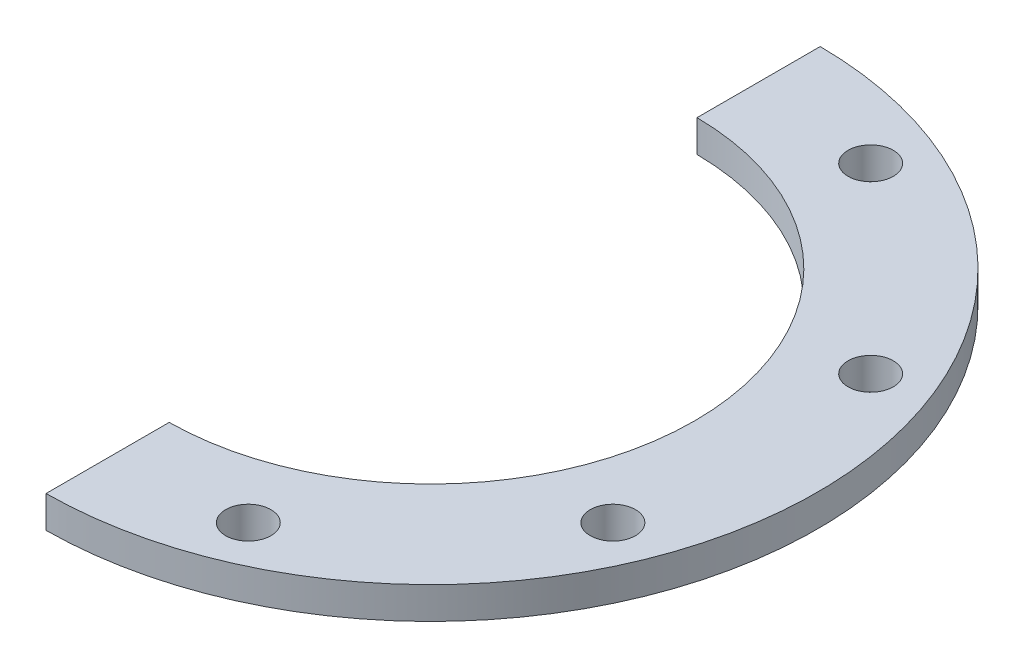
ISO-10303-21;
HEADER;
FILE_DESCRIPTION(('STEP AP214'),'2;1');
FILE_NAME('part.step','',(''),(''),'','','');
FILE_SCHEMA(('AUTOMOTIVE_DESIGN { 1 0 10303 214 1 1 1 1 }'));
ENDSEC;
DATA;
#1=APPLICATION_CONTEXT('core data for automotive mechanical design processes');
#2=APPLICATION_PROTOCOL_DEFINITION('international standard','automotive_design',2000,#1);
#3=PRODUCT_CONTEXT('',#1,'mechanical');
#4=PRODUCT('Part','Part','',(#3));
#5=PRODUCT_RELATED_PRODUCT_CATEGORY('part','',(#4));
#6=PRODUCT_DEFINITION_FORMATION('','',#4);
#7=PRODUCT_DEFINITION_CONTEXT('part definition',#1,'design');
#8=PRODUCT_DEFINITION('design','',#6,#7);
#9=PRODUCT_DEFINITION_SHAPE('','',#8);
#10=(LENGTH_UNIT() NAMED_UNIT(*) SI_UNIT(.MILLI.,.METRE.));
#11=(NAMED_UNIT(*) PLANE_ANGLE_UNIT() SI_UNIT($,.RADIAN.));
#12=(NAMED_UNIT(*) SI_UNIT($,.STERADIAN.) SOLID_ANGLE_UNIT());
#13=UNCERTAINTY_MEASURE_WITH_UNIT(LENGTH_MEASURE(1.E-05),#10,'distance_accuracy_value','');
#14=(GEOMETRIC_REPRESENTATION_CONTEXT(3) GLOBAL_UNCERTAINTY_ASSIGNED_CONTEXT((#13)) GLOBAL_UNIT_ASSIGNED_CONTEXT((#10,
#11,#12)) REPRESENTATION_CONTEXT('',''));
#15=CARTESIAN_POINT('',(0.,0.,0.));
#16=DIRECTION('',(0.,0.,1.));
#17=DIRECTION('',(1.,0.,0.));
#18=AXIS2_PLACEMENT_3D('',#15,#16,#17);
#19=CARTESIAN_POINT('',(0.,84.005,0.));
#20=DIRECTION('',(0.,1.,0.));
#21=DIRECTION('',(0.,0.,1.));
#22=AXIS2_PLACEMENT_3D('',#19,#20,#21);
#23=CYLINDRICAL_SURFACE('',#22,26.25);
#24=CARTESIAN_POINT('',(0.,87.18,0.));
#25=DIRECTION('',(0.,1.,0.));
#26=DIRECTION('',(0.,0.,1.));
#27=AXIS2_PLACEMENT_3D('',#24,#25,#26);
#28=CIRCLE('',#27,26.25);
#29=CARTESIAN_POINT('',(0.250000000000008,87.18,26.2488094968134));
#30=VERTEX_POINT('',#29);
#31=CARTESIAN_POINT('',(0.250000000000008,87.18,-26.2488094968134));
#32=VERTEX_POINT('',#31);
#33=EDGE_CURVE('E117',#30,#32,#28,.T.);
#34=ORIENTED_EDGE('',*,*,#33,.T.);
#35=DIRECTION('',(0.,1.,0.));
#36=VECTOR('',#35,1.);
#37=CARTESIAN_POINT('',(0.250000000000008,84.005,-26.2488094968134));
#38=LINE('',#37,#36);
#39=CARTESIAN_POINT('',(0.250000000000008,84.005,-26.2488094968134));
#40=VERTEX_POINT('',#39);
#41=EDGE_CURVE('E11',#40,#32,#38,.T.);
#42=ORIENTED_EDGE('',*,*,#41,.F.);
#43=CARTESIAN_POINT('',(0.,84.005,0.));
#44=DIRECTION('',(0.,1.,0.));
#45=DIRECTION('',(0.,0.,1.));
#46=AXIS2_PLACEMENT_3D('',#43,#44,#45);
#47=CIRCLE('',#46,26.25);
#48=CARTESIAN_POINT('',(0.250000000000008,84.005,26.2488094968134));
#49=VERTEX_POINT('',#48);
#50=EDGE_CURVE('E60',#49,#40,#47,.T.);
#51=ORIENTED_EDGE('',*,*,#50,.F.);
#52=DIRECTION('',(0.,1.,0.));
#53=VECTOR('',#52,1.);
#54=CARTESIAN_POINT('',(0.250000000000008,84.005,26.2488094968134));
#55=LINE('',#54,#53);
#56=EDGE_CURVE('E45',#49,#30,#55,.T.);
#57=ORIENTED_EDGE('',*,*,#56,.T.);
#58=EDGE_LOOP('',(#34,#42,#51,#57));
#59=FACE_BOUND('',#58,.T.);
#60=ADVANCED_FACE('F42',(#59),#23,.F.);
#61=CARTESIAN_POINT('',(0.250000000000008,84.005,0.));
#62=DIRECTION('',(-1.,0.,0.));
#63=DIRECTION('',(0.,0.,1.));
#64=AXIS2_PLACEMENT_3D('',#61,#62,#63);
#65=PLANE('',#64);
#66=DIRECTION('',(0.,0.,1.));
#67=VECTOR('',#66,1.);
#68=CARTESIAN_POINT('',(0.250000000000008,87.18,0.));
#69=LINE('',#68,#67);
#70=CARTESIAN_POINT('',(0.250000000000008,87.18,-38.4991883031318));
#71=VERTEX_POINT('',#70);
#72=EDGE_CURVE('E122',#71,#32,#69,.T.);
#73=ORIENTED_EDGE('',*,*,#72,.F.);
#74=DIRECTION('',(0.,1.,0.));
#75=VECTOR('',#74,1.);
#76=CARTESIAN_POINT('',(0.250000000000008,84.005,-38.4991883031318));
#77=LINE('',#76,#75);
#78=CARTESIAN_POINT('',(0.250000000000008,84.005,-38.4991883031318));
#79=VERTEX_POINT('',#78);
#80=EDGE_CURVE('E51',#79,#71,#77,.T.);
#81=ORIENTED_EDGE('',*,*,#80,.F.);
#82=DIRECTION('',(0.,0.,1.));
#83=VECTOR('',#82,1.);
#84=CARTESIAN_POINT('',(0.250000000000008,84.005,0.));
#85=LINE('',#84,#83);
#86=EDGE_CURVE('E100',#79,#40,#85,.T.);
#87=ORIENTED_EDGE('',*,*,#86,.T.);
#88=ORIENTED_EDGE('',*,*,#41,.T.);
#89=EDGE_LOOP('',(#73,#81,#87,#88));
#90=FACE_BOUND('',#89,.T.);
#91=ADVANCED_FACE('F153',(#90),#65,.T.);
#92=CARTESIAN_POINT('',(0.,84.005,0.));
#93=DIRECTION('',(0.,1.,0.));
#94=DIRECTION('',(0.,0.,1.));
#95=AXIS2_PLACEMENT_3D('',#92,#93,#94);
#96=CYLINDRICAL_SURFACE('',#95,38.5);
#97=CARTESIAN_POINT('',(0.,87.18,0.));
#98=DIRECTION('',(0.,1.,0.));
#99=DIRECTION('',(0.,0.,1.));
#100=AXIS2_PLACEMENT_3D('',#97,#98,#99);
#101=CIRCLE('',#100,38.5);
#102=CARTESIAN_POINT('',(0.250000000000008,87.18,38.4991883031318));
#103=VERTEX_POINT('',#102);
#104=EDGE_CURVE('E92',#103,#71,#101,.T.);
#105=ORIENTED_EDGE('',*,*,#104,.F.);
#106=DIRECTION('',(0.,1.,0.));
#107=VECTOR('',#106,1.);
#108=CARTESIAN_POINT('',(0.250000000000008,84.005,38.4991883031318));
#109=LINE('',#108,#107);
#110=CARTESIAN_POINT('',(0.250000000000008,84.005,38.4991883031318));
#111=VERTEX_POINT('',#110);
#112=EDGE_CURVE('E89',#111,#103,#109,.T.);
#113=ORIENTED_EDGE('',*,*,#112,.F.);
#114=CARTESIAN_POINT('',(0.,84.005,0.));
#115=DIRECTION('',(0.,1.,0.));
#116=DIRECTION('',(0.,0.,1.));
#117=AXIS2_PLACEMENT_3D('',#114,#115,#116);
#118=CIRCLE('',#117,38.5);
#119=EDGE_CURVE('E91',#111,#79,#118,.T.);
#120=ORIENTED_EDGE('',*,*,#119,.T.);
#121=ORIENTED_EDGE('',*,*,#80,.T.);
#122=EDGE_LOOP('',(#105,#113,#120,#121));
#123=FACE_BOUND('',#122,.T.);
#124=ADVANCED_FACE('F90',(#123),#96,.T.);
#125=CARTESIAN_POINT('',(30.9499643391282,84.005,12.8198949842303));
#126=DIRECTION('',(0.,1.,0.));
#127=DIRECTION('',(0.,0.,1.));
#128=AXIS2_PLACEMENT_3D('',#125,#126,#127);
#129=CYLINDRICAL_SURFACE('',#128,2.25);
#130=CARTESIAN_POINT('',(30.9499643391282,84.005,12.8198949842303));
#131=DIRECTION('',(0.,1.,0.));
#132=DIRECTION('',(0.,0.,1.));
#133=AXIS2_PLACEMENT_3D('',#130,#131,#132);
#134=CIRCLE('',#133,2.25);
#135=CARTESIAN_POINT('',(30.9499643391282,84.005,15.0698949842303));
#136=VERTEX_POINT('',#135);
#137=EDGE_CURVE('E111',#136,#136,#134,.T.);
#138=ORIENTED_EDGE('',*,*,#137,.F.);
#139=EDGE_LOOP('',(#138));
#140=FACE_BOUND('',#139,.T.);
#141=CARTESIAN_POINT('',(30.9499643391282,87.18,12.8198949842303));
#142=DIRECTION('',(0.,1.,0.));
#143=DIRECTION('',(0.,0.,1.));
#144=AXIS2_PLACEMENT_3D('',#141,#142,#143);
#145=CIRCLE('',#144,2.25);
#146=CARTESIAN_POINT('',(30.9499643391282,87.18,15.0698949842303));
#147=VERTEX_POINT('',#146);
#148=EDGE_CURVE('E131',#147,#147,#145,.T.);
#149=ORIENTED_EDGE('',*,*,#148,.T.);
#150=EDGE_LOOP('',(#149));
#151=FACE_BOUND('',#150,.T.);
#152=ADVANCED_FACE('F162',(#140,#151),#129,.F.);
#153=CARTESIAN_POINT('',(30.9499643391281,84.005,-12.8198949842307));
#154=DIRECTION('',(0.,1.,0.));
#155=DIRECTION('',(0.,0.,1.));
#156=AXIS2_PLACEMENT_3D('',#153,#154,#155);
#157=CYLINDRICAL_SURFACE('',#156,2.25);
#158=CARTESIAN_POINT('',(30.9499643391281,84.005,-12.8198949842307));
#159=DIRECTION('',(0.,1.,0.));
#160=DIRECTION('',(0.,0.,1.));
#161=AXIS2_PLACEMENT_3D('',#158,#159,#160);
#162=CIRCLE('',#161,2.25);
#163=CARTESIAN_POINT('',(30.9499643391281,84.005,-10.5698949842307));
#164=VERTEX_POINT('',#163);
#165=EDGE_CURVE('E108',#164,#164,#162,.T.);
#166=ORIENTED_EDGE('',*,*,#165,.F.);
#167=EDGE_LOOP('',(#166));
#168=FACE_BOUND('',#167,.T.);
#169=CARTESIAN_POINT('',(30.9499643391281,87.18,-12.8198949842307));
#170=DIRECTION('',(0.,1.,0.));
#171=DIRECTION('',(0.,0.,1.));
#172=AXIS2_PLACEMENT_3D('',#169,#170,#171);
#173=CIRCLE('',#172,2.25);
#174=CARTESIAN_POINT('',(30.9499643391281,87.18,-10.5698949842307));
#175=VERTEX_POINT('',#174);
#176=EDGE_CURVE('E128',#175,#175,#173,.T.);
#177=ORIENTED_EDGE('',*,*,#176,.T.);
#178=EDGE_LOOP('',(#177));
#179=FACE_BOUND('',#178,.T.);
#180=ADVANCED_FACE('F173',(#168,#179),#157,.F.);
#181=CARTESIAN_POINT('',(12.8198949842303,84.005,-30.9499643391282));
#182=DIRECTION('',(0.,1.,0.));
#183=DIRECTION('',(0.,0.,1.));
#184=AXIS2_PLACEMENT_3D('',#181,#182,#183);
#185=CYLINDRICAL_SURFACE('',#184,2.25);
#186=CARTESIAN_POINT('',(12.8198949842303,84.005,-30.9499643391282));
#187=DIRECTION('',(0.,1.,0.));
#188=DIRECTION('',(0.,0.,1.));
#189=AXIS2_PLACEMENT_3D('',#186,#187,#188);
#190=CIRCLE('',#189,2.25);
#191=CARTESIAN_POINT('',(12.8198949842303,84.005,-28.6999643391282));
#192=VERTEX_POINT('',#191);
#193=EDGE_CURVE('E102',#192,#192,#190,.T.);
#194=ORIENTED_EDGE('',*,*,#193,.F.);
#195=EDGE_LOOP('',(#194));
#196=FACE_BOUND('',#195,.T.);
#197=CARTESIAN_POINT('',(12.8198949842303,87.18,-30.9499643391282));
#198=DIRECTION('',(0.,1.,0.));
#199=DIRECTION('',(0.,0.,1.));
#200=AXIS2_PLACEMENT_3D('',#197,#198,#199);
#201=CIRCLE('',#200,2.25);
#202=CARTESIAN_POINT('',(12.8198949842303,87.18,-28.6999643391282));
#203=VERTEX_POINT('',#202);
#204=EDGE_CURVE('E125',#203,#203,#201,.T.);
#205=ORIENTED_EDGE('',*,*,#204,.T.);
#206=EDGE_LOOP('',(#205));
#207=FACE_BOUND('',#206,.T.);
#208=ADVANCED_FACE('F165',(#196,#207),#185,.F.);
#209=CARTESIAN_POINT('',(0.250000000000008,84.005,0.));
#210=DIRECTION('',(1.,0.,0.));
#211=DIRECTION('',(0.,0.,-1.));
#212=AXIS2_PLACEMENT_3D('',#209,#210,#211);
#213=PLANE('',#212);
#214=DIRECTION('',(0.,0.,-1.));
#215=VECTOR('',#214,1.);
#216=CARTESIAN_POINT('',(0.250000000000008,87.18,0.));
#217=LINE('',#216,#215);
#218=EDGE_CURVE('E119',#103,#30,#217,.T.);
#219=ORIENTED_EDGE('',*,*,#218,.T.);
#220=ORIENTED_EDGE('',*,*,#56,.F.);
#221=DIRECTION('',(0.,0.,-1.));
#222=VECTOR('',#221,1.);
#223=CARTESIAN_POINT('',(0.250000000000008,84.005,0.));
#224=LINE('',#223,#222);
#225=EDGE_CURVE('E86',#111,#49,#224,.T.);
#226=ORIENTED_EDGE('',*,*,#225,.F.);
#227=ORIENTED_EDGE('',*,*,#112,.T.);
#228=EDGE_LOOP('',(#219,#220,#226,#227));
#229=FACE_BOUND('',#228,.T.);
#230=ADVANCED_FACE('F95',(#229),#213,.F.);
#231=CARTESIAN_POINT('',(12.8198949842307,84.005,30.949964339128));
#232=DIRECTION('',(0.,1.,0.));
#233=DIRECTION('',(0.,0.,1.));
#234=AXIS2_PLACEMENT_3D('',#231,#232,#233);
#235=CYLINDRICAL_SURFACE('',#234,2.25);
#236=CARTESIAN_POINT('',(12.8198949842307,84.005,30.949964339128));
#237=DIRECTION('',(0.,1.,0.));
#238=DIRECTION('',(0.,0.,1.));
#239=AXIS2_PLACEMENT_3D('',#236,#237,#238);
#240=CIRCLE('',#239,2.25);
#241=CARTESIAN_POINT('',(12.8198949842307,84.005,33.199964339128));
#242=VERTEX_POINT('',#241);
#243=EDGE_CURVE('E114',#242,#242,#240,.T.);
#244=ORIENTED_EDGE('',*,*,#243,.F.);
#245=EDGE_LOOP('',(#244));
#246=FACE_BOUND('',#245,.T.);
#247=CARTESIAN_POINT('',(12.8198949842307,87.18,30.949964339128));
#248=DIRECTION('',(0.,1.,0.));
#249=DIRECTION('',(0.,0.,1.));
#250=AXIS2_PLACEMENT_3D('',#247,#248,#249);
#251=CIRCLE('',#250,2.25);
#252=CARTESIAN_POINT('',(12.8198949842307,87.18,33.199964339128));
#253=VERTEX_POINT('',#252);
#254=EDGE_CURVE('E134',#253,#253,#251,.T.);
#255=ORIENTED_EDGE('',*,*,#254,.T.);
#256=EDGE_LOOP('',(#255));
#257=FACE_BOUND('',#256,.T.);
#258=ADVANCED_FACE('F139',(#246,#257),#235,.F.);
#259=CARTESIAN_POINT('',(0.,84.005,0.));
#260=DIRECTION('',(0.,1.,0.));
#261=DIRECTION('',(0.,0.,1.));
#262=AXIS2_PLACEMENT_3D('',#259,#260,#261);
#263=PLANE('',#262);
#264=ORIENTED_EDGE('',*,*,#50,.T.);
#265=ORIENTED_EDGE('',*,*,#86,.F.);
#266=ORIENTED_EDGE('',*,*,#119,.F.);
#267=ORIENTED_EDGE('',*,*,#225,.T.);
#268=EDGE_LOOP('',(#264,#265,#266,#267));
#269=FACE_BOUND('',#268,.T.);
#270=ORIENTED_EDGE('',*,*,#193,.T.);
#271=EDGE_LOOP('',(#270));
#272=FACE_BOUND('',#271,.T.);
#273=ORIENTED_EDGE('',*,*,#165,.T.);
#274=EDGE_LOOP('',(#273));
#275=FACE_BOUND('',#274,.T.);
#276=ORIENTED_EDGE('',*,*,#137,.T.);
#277=EDGE_LOOP('',(#276));
#278=FACE_BOUND('',#277,.T.);
#279=ORIENTED_EDGE('',*,*,#243,.T.);
#280=EDGE_LOOP('',(#279));
#281=FACE_BOUND('',#280,.T.);
#282=ADVANCED_FACE('F98',(#269,#272,#275,#278,#281),#263,.F.);
#283=CARTESIAN_POINT('',(0.,87.18,0.));
#284=DIRECTION('',(0.,1.,0.));
#285=DIRECTION('',(0.,0.,1.));
#286=AXIS2_PLACEMENT_3D('',#283,#284,#285);
#287=PLANE('',#286);
#288=ORIENTED_EDGE('',*,*,#33,.F.);
#289=ORIENTED_EDGE('',*,*,#218,.F.);
#290=ORIENTED_EDGE('',*,*,#104,.T.);
#291=ORIENTED_EDGE('',*,*,#72,.T.);
#292=EDGE_LOOP('',(#288,#289,#290,#291));
#293=FACE_BOUND('',#292,.T.);
#294=ORIENTED_EDGE('',*,*,#204,.F.);
#295=EDGE_LOOP('',(#294));
#296=FACE_BOUND('',#295,.T.);
#297=ORIENTED_EDGE('',*,*,#176,.F.);
#298=EDGE_LOOP('',(#297));
#299=FACE_BOUND('',#298,.T.);
#300=ORIENTED_EDGE('',*,*,#148,.F.);
#301=EDGE_LOOP('',(#300));
#302=FACE_BOUND('',#301,.T.);
#303=ORIENTED_EDGE('',*,*,#254,.F.);
#304=EDGE_LOOP('',(#303));
#305=FACE_BOUND('',#304,.T.);
#306=ADVANCED_FACE('F141',(#293,#296,#299,#302,#305),#287,.T.);
#307=CLOSED_SHELL('',(#60,#91,#124,#152,#180,#208,#230,#258,#282,#306));
#308=MANIFOLD_SOLID_BREP('B2',#307);
#309=ADVANCED_BREP_SHAPE_REPRESENTATION('',(#18,#308),#14);
#310=SHAPE_DEFINITION_REPRESENTATION(#9,#309);
ENDSEC;
END-ISO-10303-21;
